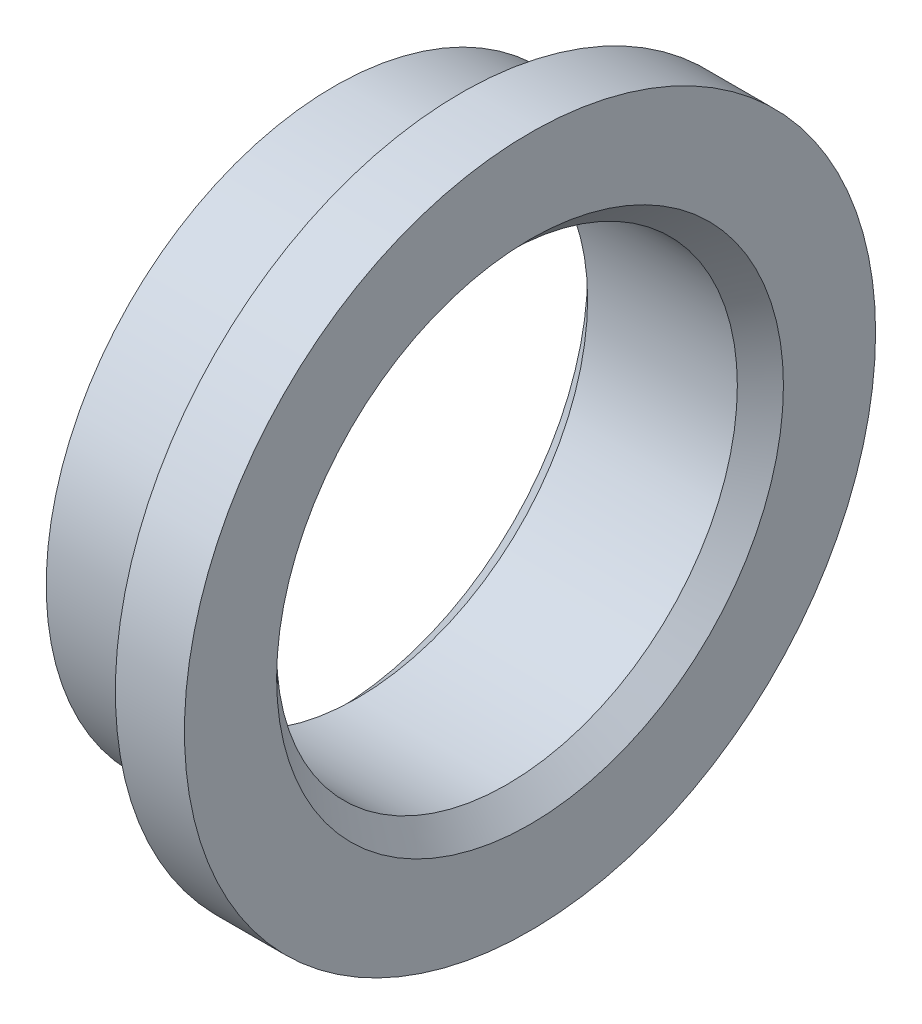
ISO-10303-21;
HEADER;
FILE_DESCRIPTION(('STEP AP214'),'2;1');
FILE_NAME('part.step','',(''),(''),'','','');
FILE_SCHEMA(('AUTOMOTIVE_DESIGN { 1 0 10303 214 1 1 1 1 }'));
ENDSEC;
DATA;
#1=APPLICATION_CONTEXT('core data for automotive mechanical design processes');
#2=APPLICATION_PROTOCOL_DEFINITION('international standard','automotive_design',2000,#1);
#3=PRODUCT_CONTEXT('',#1,'mechanical');
#4=PRODUCT('Part','Part','',(#3));
#5=PRODUCT_RELATED_PRODUCT_CATEGORY('part','',(#4));
#6=PRODUCT_DEFINITION_FORMATION('','',#4);
#7=PRODUCT_DEFINITION_CONTEXT('part definition',#1,'design');
#8=PRODUCT_DEFINITION('design','',#6,#7);
#9=PRODUCT_DEFINITION_SHAPE('','',#8);
#10=(LENGTH_UNIT() NAMED_UNIT(*) SI_UNIT(.MILLI.,.METRE.));
#11=(NAMED_UNIT(*) PLANE_ANGLE_UNIT() SI_UNIT($,.RADIAN.));
#12=(NAMED_UNIT(*) SI_UNIT($,.STERADIAN.) SOLID_ANGLE_UNIT());
#13=UNCERTAINTY_MEASURE_WITH_UNIT(LENGTH_MEASURE(1.E-05),#10,'distance_accuracy_value','');
#14=(GEOMETRIC_REPRESENTATION_CONTEXT(3) GLOBAL_UNCERTAINTY_ASSIGNED_CONTEXT((#13)) GLOBAL_UNIT_ASSIGNED_CONTEXT((#10,
#11,#12)) REPRESENTATION_CONTEXT('',''));
#15=CARTESIAN_POINT('',(0.,0.,0.));
#16=DIRECTION('',(0.,0.,1.));
#17=DIRECTION('',(1.,0.,0.));
#18=AXIS2_PLACEMENT_3D('',#15,#16,#17);
#19=CARTESIAN_POINT('',(8.5,10.,0.));
#20=DIRECTION('',(1.,0.,0.));
#21=DIRECTION('',(0.,0.,-1.));
#22=AXIS2_PLACEMENT_3D('',#19,#20,#21);
#23=PLANE('',#22);
#24=CARTESIAN_POINT('',(8.5,0.,0.));
#25=DIRECTION('',(1.,0.,0.));
#26=DIRECTION('',(0.,0.,-1.));
#27=AXIS2_PLACEMENT_3D('',#24,#25,#26);
#28=CIRCLE('',#27,11.);
#29=CARTESIAN_POINT('',(8.5,0.,-11.));
#30=VERTEX_POINT('',#29);
#31=EDGE_CURVE('E10',#30,#30,#28,.F.);
#32=ORIENTED_EDGE('',*,*,#31,.T.);
#33=EDGE_LOOP('',(#32));
#34=FACE_BOUND('',#33,.T.);
#35=CARTESIAN_POINT('',(8.5,0.,0.));
#36=DIRECTION('',(1.,0.,0.));
#37=DIRECTION('',(0.,0.,-1.));
#38=AXIS2_PLACEMENT_3D('',#35,#36,#37);
#39=CIRCLE('',#38,15.);
#40=CARTESIAN_POINT('',(8.5,0.,-15.));
#41=VERTEX_POINT('',#40);
#42=EDGE_CURVE('E68',#41,#41,#39,.T.);
#43=ORIENTED_EDGE('',*,*,#42,.T.);
#44=EDGE_LOOP('',(#43));
#45=FACE_BOUND('',#44,.T.);
#46=ADVANCED_FACE('F43',(#34,#45),#23,.T.);
#47=CARTESIAN_POINT('',(0.,0.,0.));
#48=DIRECTION('',(1.,0.,0.));
#49=DIRECTION('',(0.,0.,-1.));
#50=AXIS2_PLACEMENT_3D('',#47,#48,#49);
#51=CYLINDRICAL_SURFACE('',#50,15.);
#52=CARTESIAN_POINT('',(5.5,0.,0.));
#53=DIRECTION('',(1.,0.,0.));
#54=DIRECTION('',(0.,0.,-1.));
#55=AXIS2_PLACEMENT_3D('',#52,#53,#54);
#56=CIRCLE('',#55,15.);
#57=CARTESIAN_POINT('',(5.5,0.,-15.));
#58=VERTEX_POINT('',#57);
#59=EDGE_CURVE('E72',#58,#58,#56,.T.);
#60=ORIENTED_EDGE('',*,*,#59,.T.);
#61=EDGE_LOOP('',(#60));
#62=FACE_BOUND('',#61,.T.);
#63=ORIENTED_EDGE('',*,*,#42,.F.);
#64=EDGE_LOOP('',(#63));
#65=FACE_BOUND('',#64,.T.);
#66=ADVANCED_FACE('F102',(#62,#65),#51,.T.);
#67=CARTESIAN_POINT('',(5.5,15.,0.));
#68=DIRECTION('',(-1.,0.,0.));
#69=DIRECTION('',(0.,0.,1.));
#70=AXIS2_PLACEMENT_3D('',#67,#68,#69);
#71=PLANE('',#70);
#72=CARTESIAN_POINT('',(5.5,0.,0.));
#73=DIRECTION('',(1.,0.,0.));
#74=DIRECTION('',(0.,0.,-1.));
#75=AXIS2_PLACEMENT_3D('',#72,#73,#74);
#76=CIRCLE('',#75,12.5);
#77=CARTESIAN_POINT('',(5.5,0.,-12.5));
#78=VERTEX_POINT('',#77);
#79=EDGE_CURVE('E76',#78,#78,#76,.T.);
#80=ORIENTED_EDGE('',*,*,#79,.T.);
#81=EDGE_LOOP('',(#80));
#82=FACE_BOUND('',#81,.T.);
#83=ORIENTED_EDGE('',*,*,#59,.F.);
#84=EDGE_LOOP('',(#83));
#85=FACE_BOUND('',#84,.T.);
#86=ADVANCED_FACE('F99',(#82,#85),#71,.T.);
#87=CARTESIAN_POINT('',(0.,0.,0.));
#88=DIRECTION('',(1.,0.,0.));
#89=DIRECTION('',(0.,0.,-1.));
#90=AXIS2_PLACEMENT_3D('',#87,#88,#89);
#91=CYLINDRICAL_SURFACE('',#90,12.5);
#92=CARTESIAN_POINT('',(0.,0.,0.));
#93=DIRECTION('',(1.,0.,0.));
#94=DIRECTION('',(0.,0.,-1.));
#95=AXIS2_PLACEMENT_3D('',#92,#93,#94);
#96=CIRCLE('',#95,12.5);
#97=CARTESIAN_POINT('',(0.,0.,-12.5));
#98=VERTEX_POINT('',#97);
#99=EDGE_CURVE('E80',#98,#98,#96,.T.);
#100=ORIENTED_EDGE('',*,*,#99,.T.);
#101=EDGE_LOOP('',(#100));
#102=FACE_BOUND('',#101,.T.);
#103=ORIENTED_EDGE('',*,*,#79,.F.);
#104=EDGE_LOOP('',(#103));
#105=FACE_BOUND('',#104,.T.);
#106=ADVANCED_FACE('F85',(#102,#105),#91,.T.);
#107=CARTESIAN_POINT('',(0.,12.5,0.));
#108=DIRECTION('',(-1.,0.,0.));
#109=DIRECTION('',(0.,0.,1.));
#110=AXIS2_PLACEMENT_3D('',#107,#108,#109);
#111=PLANE('',#110);
#112=CARTESIAN_POINT('',(0.,0.,0.));
#113=DIRECTION('',(-1.,0.,0.));
#114=DIRECTION('',(0.,0.,1.));
#115=AXIS2_PLACEMENT_3D('',#112,#113,#114);
#116=CIRCLE('',#115,11.);
#117=CARTESIAN_POINT('',(0.,0.,11.));
#118=VERTEX_POINT('',#117);
#119=EDGE_CURVE('E62',#118,#118,#116,.F.);
#120=ORIENTED_EDGE('',*,*,#119,.T.);
#121=EDGE_LOOP('',(#120));
#122=FACE_BOUND('',#121,.T.);
#123=ORIENTED_EDGE('',*,*,#99,.F.);
#124=EDGE_LOOP('',(#123));
#125=FACE_BOUND('',#124,.T.);
#126=ADVANCED_FACE('F88',(#122,#125),#111,.T.);
#127=CARTESIAN_POINT('',(0.,0.,0.));
#128=DIRECTION('',(1.,0.,0.));
#129=DIRECTION('',(0.,0.,-1.));
#130=AXIS2_PLACEMENT_3D('',#127,#128,#129);
#131=CYLINDRICAL_SURFACE('',#130,10.);
#132=CARTESIAN_POINT('',(1.00000000000001,0.,0.));
#133=DIRECTION('',(-1.,0.,0.));
#134=DIRECTION('',(0.,0.,1.));
#135=AXIS2_PLACEMENT_3D('',#132,#133,#134);
#136=CIRCLE('',#135,10.);
#137=CARTESIAN_POINT('',(1.00000000000001,0.,10.));
#138=VERTEX_POINT('',#137);
#139=EDGE_CURVE('E52',#138,#138,#136,.T.);
#140=ORIENTED_EDGE('',*,*,#139,.T.);
#141=EDGE_LOOP('',(#140));
#142=FACE_BOUND('',#141,.T.);
#143=CARTESIAN_POINT('',(7.49999999999999,0.,0.));
#144=DIRECTION('',(1.,0.,0.));
#145=DIRECTION('',(0.,0.,-1.));
#146=AXIS2_PLACEMENT_3D('',#143,#144,#145);
#147=CIRCLE('',#146,10.);
#148=CARTESIAN_POINT('',(7.49999999999999,0.,-10.));
#149=VERTEX_POINT('',#148);
#150=EDGE_CURVE('E57',#149,#149,#147,.T.);
#151=ORIENTED_EDGE('',*,*,#150,.T.);
#152=EDGE_LOOP('',(#151));
#153=FACE_BOUND('',#152,.T.);
#154=ADVANCED_FACE('F90',(#142,#153),#131,.F.);
#155=CARTESIAN_POINT('',(0.,0.,0.));
#156=DIRECTION('',(-1.,0.,0.));
#157=DIRECTION('',(0.,0.,1.));
#158=AXIS2_PLACEMENT_3D('',#155,#156,#157);
#159=CONICAL_SURFACE('',#158,11.,0.78539816339745);
#160=ORIENTED_EDGE('',*,*,#139,.F.);
#161=EDGE_LOOP('',(#160));
#162=FACE_BOUND('',#161,.T.);
#163=ORIENTED_EDGE('',*,*,#119,.F.);
#164=EDGE_LOOP('',(#163));
#165=FACE_BOUND('',#164,.T.);
#166=ADVANCED_FACE('F97',(#162,#165),#159,.F.);
#167=CARTESIAN_POINT('',(7.49999999999999,0.,0.));
#168=DIRECTION('',(1.,0.,0.));
#169=DIRECTION('',(0.,0.,-1.));
#170=AXIS2_PLACEMENT_3D('',#167,#168,#169);
#171=CONICAL_SURFACE('',#170,10.,0.78539816339745);
#172=ORIENTED_EDGE('',*,*,#31,.F.);
#173=EDGE_LOOP('',(#172));
#174=FACE_BOUND('',#173,.T.);
#175=ORIENTED_EDGE('',*,*,#150,.F.);
#176=EDGE_LOOP('',(#175));
#177=FACE_BOUND('',#176,.T.);
#178=ADVANCED_FACE('F46',(#174,#177),#171,.F.);
#179=CLOSED_SHELL('',(#46,#66,#86,#106,#126,#154,#166,#178));
#180=MANIFOLD_SOLID_BREP('B2',#179);
#181=ADVANCED_BREP_SHAPE_REPRESENTATION('',(#18,#180),#14);
#182=SHAPE_DEFINITION_REPRESENTATION(#9,#181);
ENDSEC;
END-ISO-10303-21;
